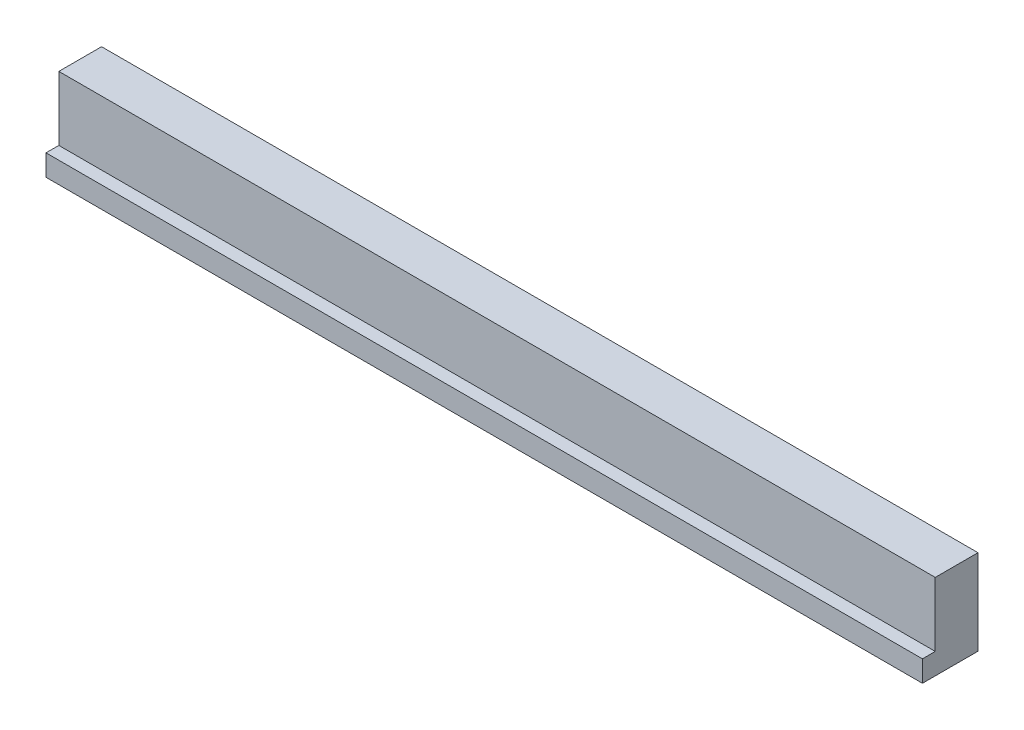
ISO-10303-21;
HEADER;
FILE_DESCRIPTION(('STEP AP214'),'2;1');
FILE_NAME('part.step','',(''),(''),'','','');
FILE_SCHEMA(('AUTOMOTIVE_DESIGN { 1 0 10303 214 1 1 1 1 }'));
ENDSEC;
DATA;
#1=APPLICATION_CONTEXT('core data for automotive mechanical design processes');
#2=APPLICATION_PROTOCOL_DEFINITION('international standard','automotive_design',2000,#1);
#3=PRODUCT_CONTEXT('',#1,'mechanical');
#4=PRODUCT('Part','Part','',(#3));
#5=PRODUCT_RELATED_PRODUCT_CATEGORY('part','',(#4));
#6=PRODUCT_DEFINITION_FORMATION('','',#4);
#7=PRODUCT_DEFINITION_CONTEXT('part definition',#1,'design');
#8=PRODUCT_DEFINITION('design','',#6,#7);
#9=PRODUCT_DEFINITION_SHAPE('','',#8);
#10=(LENGTH_UNIT() NAMED_UNIT(*) SI_UNIT(.MILLI.,.METRE.));
#11=(NAMED_UNIT(*) PLANE_ANGLE_UNIT() SI_UNIT($,.RADIAN.));
#12=(NAMED_UNIT(*) SI_UNIT($,.STERADIAN.) SOLID_ANGLE_UNIT());
#13=UNCERTAINTY_MEASURE_WITH_UNIT(LENGTH_MEASURE(1.E-05),#10,'distance_accuracy_value','');
#14=(GEOMETRIC_REPRESENTATION_CONTEXT(3) GLOBAL_UNCERTAINTY_ASSIGNED_CONTEXT((#13)) GLOBAL_UNIT_ASSIGNED_CONTEXT((#10,
#11,#12)) REPRESENTATION_CONTEXT('',''));
#15=CARTESIAN_POINT('',(0.,0.,0.));
#16=DIRECTION('',(0.,0.,1.));
#17=DIRECTION('',(1.,0.,0.));
#18=AXIS2_PLACEMENT_3D('',#15,#16,#17);
#19=CARTESIAN_POINT('',(-260.35,6.2992,0.));
#20=DIRECTION('',(0.,0.,1.));
#21=DIRECTION('',(0.,-1.,0.));
#22=AXIS2_PLACEMENT_3D('',#19,#20,#21);
#23=PLANE('',#22);
#24=DIRECTION('',(0.,-1.,0.));
#25=VECTOR('',#24,1.);
#26=CARTESIAN_POINT('',(0.,6.2992,0.));
#27=LINE('',#26,#25);
#28=CARTESIAN_POINT('',(0.,6.2992,0.));
#29=VERTEX_POINT('',#28);
#30=CARTESIAN_POINT('',(0.,0.,0.));
#31=VERTEX_POINT('',#30);
#32=EDGE_CURVE('E118',#29,#31,#27,.T.);
#33=ORIENTED_EDGE('',*,*,#32,.F.);
#34=DIRECTION('',(1.,0.,0.));
#35=VECTOR('',#34,1.);
#36=CARTESIAN_POINT('',(-260.35,6.2992,0.));
#37=LINE('',#36,#35);
#38=CARTESIAN_POINT('',(-260.35,6.2992,0.));
#39=VERTEX_POINT('',#38);
#40=EDGE_CURVE('E11',#39,#29,#37,.T.);
#41=ORIENTED_EDGE('',*,*,#40,.F.);
#42=DIRECTION('',(0.,-1.,0.));
#43=VECTOR('',#42,1.);
#44=CARTESIAN_POINT('',(-260.35,6.2992,0.));
#45=LINE('',#44,#43);
#46=CARTESIAN_POINT('',(-260.35,0.,0.));
#47=VERTEX_POINT('',#46);
#48=EDGE_CURVE('E132',#39,#47,#45,.T.);
#49=ORIENTED_EDGE('',*,*,#48,.T.);
#50=DIRECTION('',(1.,0.,0.));
#51=VECTOR('',#50,1.);
#52=CARTESIAN_POINT('',(-260.35,0.,0.));
#53=LINE('',#52,#51);
#54=EDGE_CURVE('E36',#47,#31,#53,.T.);
#55=ORIENTED_EDGE('',*,*,#54,.T.);
#56=EDGE_LOOP('',(#33,#41,#49,#55));
#57=FACE_BOUND('',#56,.T.);
#58=ADVANCED_FACE('F33',(#57),#23,.T.);
#59=CARTESIAN_POINT('',(-260.35,6.2992,-3.81));
#60=DIRECTION('',(0.,1.,0.));
#61=DIRECTION('',(0.,0.,1.));
#62=AXIS2_PLACEMENT_3D('',#59,#60,#61);
#63=PLANE('',#62);
#64=DIRECTION('',(0.,0.,1.));
#65=VECTOR('',#64,1.);
#66=CARTESIAN_POINT('',(0.,6.2992,-3.81));
#67=LINE('',#66,#65);
#68=CARTESIAN_POINT('',(0.,6.2992,-3.81));
#69=VERTEX_POINT('',#68);
#70=EDGE_CURVE('E130',#69,#29,#67,.T.);
#71=ORIENTED_EDGE('',*,*,#70,.F.);
#72=DIRECTION('',(1.,0.,0.));
#73=VECTOR('',#72,1.);
#74=CARTESIAN_POINT('',(-260.35,6.2992,-3.81));
#75=LINE('',#74,#73);
#76=CARTESIAN_POINT('',(-260.35,6.2992,-3.81));
#77=VERTEX_POINT('',#76);
#78=EDGE_CURVE('E42',#77,#69,#75,.T.);
#79=ORIENTED_EDGE('',*,*,#78,.F.);
#80=DIRECTION('',(0.,0.,1.));
#81=VECTOR('',#80,1.);
#82=CARTESIAN_POINT('',(-260.35,6.2992,-3.81));
#83=LINE('',#82,#81);
#84=EDGE_CURVE('E108',#77,#39,#83,.T.);
#85=ORIENTED_EDGE('',*,*,#84,.T.);
#86=ORIENTED_EDGE('',*,*,#40,.T.);
#87=EDGE_LOOP('',(#71,#79,#85,#86));
#88=FACE_BOUND('',#87,.T.);
#89=ADVANCED_FACE('F140',(#88),#63,.T.);
#90=CARTESIAN_POINT('',(-260.35,25.3492,-3.81));
#91=DIRECTION('',(0.,0.,1.));
#92=DIRECTION('',(0.,-1.,0.));
#93=AXIS2_PLACEMENT_3D('',#90,#91,#92);
#94=PLANE('',#93);
#95=DIRECTION('',(0.,-1.,0.));
#96=VECTOR('',#95,1.);
#97=CARTESIAN_POINT('',(0.,25.3492,-3.81));
#98=LINE('',#97,#96);
#99=CARTESIAN_POINT('',(0.,25.3492,-3.81));
#100=VERTEX_POINT('',#99);
#101=EDGE_CURVE('E95',#100,#69,#98,.T.);
#102=ORIENTED_EDGE('',*,*,#101,.F.);
#103=DIRECTION('',(1.,0.,0.));
#104=VECTOR('',#103,1.);
#105=CARTESIAN_POINT('',(-260.35,25.3492,-3.81));
#106=LINE('',#105,#104);
#107=CARTESIAN_POINT('',(-260.35,25.3492,-3.81));
#108=VERTEX_POINT('',#107);
#109=EDGE_CURVE('E90',#108,#100,#106,.T.);
#110=ORIENTED_EDGE('',*,*,#109,.F.);
#111=DIRECTION('',(0.,-1.,0.));
#112=VECTOR('',#111,1.);
#113=CARTESIAN_POINT('',(-260.35,25.3492,-3.81));
#114=LINE('',#113,#112);
#115=EDGE_CURVE('E93',#108,#77,#114,.T.);
#116=ORIENTED_EDGE('',*,*,#115,.T.);
#117=ORIENTED_EDGE('',*,*,#78,.T.);
#118=EDGE_LOOP('',(#102,#110,#116,#117));
#119=FACE_BOUND('',#118,.T.);
#120=ADVANCED_FACE('F92',(#119),#94,.T.);
#121=CARTESIAN_POINT('',(-260.35,25.3492,-16.51));
#122=DIRECTION('',(0.,1.,0.));
#123=DIRECTION('',(0.,0.,1.));
#124=AXIS2_PLACEMENT_3D('',#121,#122,#123);
#125=PLANE('',#124);
#126=DIRECTION('',(0.,0.,1.));
#127=VECTOR('',#126,1.);
#128=CARTESIAN_POINT('',(0.,25.3492,-16.51));
#129=LINE('',#128,#127);
#130=CARTESIAN_POINT('',(0.,25.3492,-16.51));
#131=VERTEX_POINT('',#130);
#132=EDGE_CURVE('E127',#131,#100,#129,.T.);
#133=ORIENTED_EDGE('',*,*,#132,.F.);
#134=DIRECTION('',(1.,0.,0.));
#135=VECTOR('',#134,1.);
#136=CARTESIAN_POINT('',(-260.35,25.3492,-16.51));
#137=LINE('',#136,#135);
#138=CARTESIAN_POINT('',(-260.35,25.3492,-16.51));
#139=VERTEX_POINT('',#138);
#140=EDGE_CURVE('E100',#139,#131,#137,.T.);
#141=ORIENTED_EDGE('',*,*,#140,.F.);
#142=DIRECTION('',(0.,0.,1.));
#143=VECTOR('',#142,1.);
#144=CARTESIAN_POINT('',(-260.35,25.3492,-16.51));
#145=LINE('',#144,#143);
#146=EDGE_CURVE('E106',#139,#108,#145,.T.);
#147=ORIENTED_EDGE('',*,*,#146,.T.);
#148=ORIENTED_EDGE('',*,*,#109,.T.);
#149=EDGE_LOOP('',(#133,#141,#147,#148));
#150=FACE_BOUND('',#149,.T.);
#151=ADVANCED_FACE('F110',(#150),#125,.T.);
#152=CARTESIAN_POINT('',(-260.35,0.,-16.51));
#153=DIRECTION('',(0.,0.,-1.));
#154=DIRECTION('',(-1.,0.,0.));
#155=AXIS2_PLACEMENT_3D('',#152,#153,#154);
#156=PLANE('',#155);
#157=DIRECTION('',(0.,1.,0.));
#158=VECTOR('',#157,1.);
#159=CARTESIAN_POINT('',(0.,0.,-16.51));
#160=LINE('',#159,#158);
#161=CARTESIAN_POINT('',(0.,0.,-16.51));
#162=VERTEX_POINT('',#161);
#163=EDGE_CURVE('E124',#162,#131,#160,.T.);
#164=ORIENTED_EDGE('',*,*,#163,.F.);
#165=DIRECTION('',(1.,0.,0.));
#166=VECTOR('',#165,1.);
#167=CARTESIAN_POINT('',(-260.35,0.,-16.51));
#168=LINE('',#167,#166);
#169=CARTESIAN_POINT('',(-260.35,0.,-16.51));
#170=VERTEX_POINT('',#169);
#171=EDGE_CURVE('E135',#170,#162,#168,.T.);
#172=ORIENTED_EDGE('',*,*,#171,.F.);
#173=DIRECTION('',(0.,1.,0.));
#174=VECTOR('',#173,1.);
#175=CARTESIAN_POINT('',(-260.35,0.,-16.51));
#176=LINE('',#175,#174);
#177=EDGE_CURVE('E111',#170,#139,#176,.T.);
#178=ORIENTED_EDGE('',*,*,#177,.T.);
#179=ORIENTED_EDGE('',*,*,#140,.T.);
#180=EDGE_LOOP('',(#164,#172,#178,#179));
#181=FACE_BOUND('',#180,.T.);
#182=ADVANCED_FACE('F153',(#181),#156,.T.);
#183=CARTESIAN_POINT('',(-260.35,0.,0.));
#184=DIRECTION('',(0.,-1.,0.));
#185=DIRECTION('',(0.,0.,-1.));
#186=AXIS2_PLACEMENT_3D('',#183,#184,#185);
#187=PLANE('',#186);
#188=DIRECTION('',(0.,0.,-1.));
#189=VECTOR('',#188,1.);
#190=CARTESIAN_POINT('',(0.,0.,0.));
#191=LINE('',#190,#189);
#192=EDGE_CURVE('E121',#31,#162,#191,.T.);
#193=ORIENTED_EDGE('',*,*,#192,.F.);
#194=ORIENTED_EDGE('',*,*,#54,.F.);
#195=DIRECTION('',(0.,0.,-1.));
#196=VECTOR('',#195,1.);
#197=CARTESIAN_POINT('',(-260.35,0.,0.));
#198=LINE('',#197,#196);
#199=EDGE_CURVE('E113',#47,#170,#198,.T.);
#200=ORIENTED_EDGE('',*,*,#199,.T.);
#201=ORIENTED_EDGE('',*,*,#171,.T.);
#202=EDGE_LOOP('',(#193,#194,#200,#201));
#203=FACE_BOUND('',#202,.T.);
#204=ADVANCED_FACE('F137',(#203),#187,.T.);
#205=CARTESIAN_POINT('',(-260.35,0.,0.));
#206=DIRECTION('',(1.,0.,0.));
#207=DIRECTION('',(0.,0.,-1.));
#208=AXIS2_PLACEMENT_3D('',#205,#206,#207);
#209=PLANE('',#208);
#210=ORIENTED_EDGE('',*,*,#48,.F.);
#211=ORIENTED_EDGE('',*,*,#84,.F.);
#212=ORIENTED_EDGE('',*,*,#115,.F.);
#213=ORIENTED_EDGE('',*,*,#146,.F.);
#214=ORIENTED_EDGE('',*,*,#177,.F.);
#215=ORIENTED_EDGE('',*,*,#199,.F.);
#216=EDGE_LOOP('',(#210,#211,#212,#213,#214,#215));
#217=FACE_BOUND('',#216,.T.);
#218=ADVANCED_FACE('F104',(#217),#209,.F.);
#219=CARTESIAN_POINT('',(0.,0.,0.));
#220=DIRECTION('',(1.,0.,0.));
#221=DIRECTION('',(0.,0.,-1.));
#222=AXIS2_PLACEMENT_3D('',#219,#220,#221);
#223=PLANE('',#222);
#224=ORIENTED_EDGE('',*,*,#32,.T.);
#225=ORIENTED_EDGE('',*,*,#192,.T.);
#226=ORIENTED_EDGE('',*,*,#163,.T.);
#227=ORIENTED_EDGE('',*,*,#132,.T.);
#228=ORIENTED_EDGE('',*,*,#101,.T.);
#229=ORIENTED_EDGE('',*,*,#70,.T.);
#230=EDGE_LOOP('',(#224,#225,#226,#227,#228,#229));
#231=FACE_BOUND('',#230,.T.);
#232=ADVANCED_FACE('F139',(#231),#223,.T.);
#233=CLOSED_SHELL('',(#58,#89,#120,#151,#182,#204,#218,#232));
#234=MANIFOLD_SOLID_BREP('B2',#233);
#235=ADVANCED_BREP_SHAPE_REPRESENTATION('',(#18,#234),#14);
#236=SHAPE_DEFINITION_REPRESENTATION(#9,#235);
ENDSEC;
END-ISO-10303-21;
